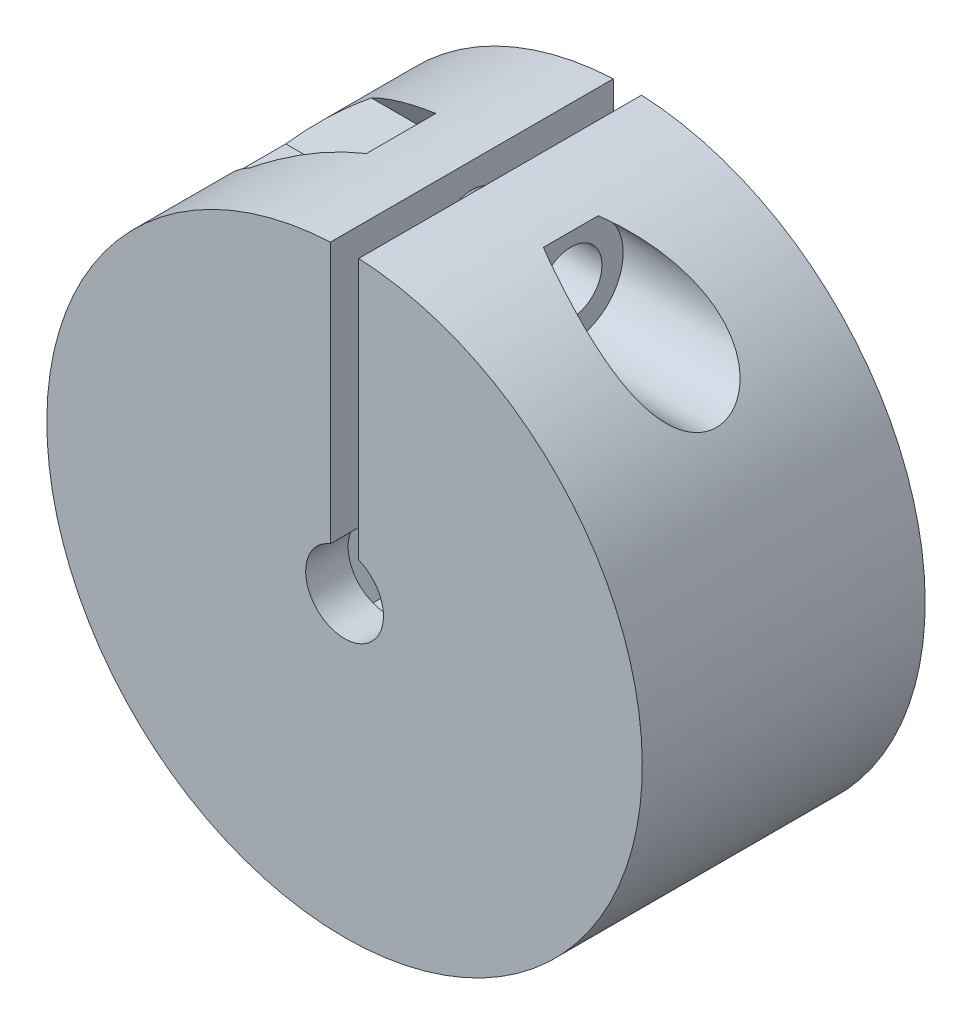
ISO-10303-21;
HEADER;
FILE_DESCRIPTION(('STEP AP214'),'2;1');
FILE_NAME('part.step','',(''),(''),'','','');
FILE_SCHEMA(('AUTOMOTIVE_DESIGN { 1 0 10303 214 1 1 1 1 }'));
ENDSEC;
DATA;
#1=APPLICATION_CONTEXT('core data for automotive mechanical design processes');
#2=APPLICATION_PROTOCOL_DEFINITION('international standard','automotive_design',2000,#1);
#3=PRODUCT_CONTEXT('',#1,'mechanical');
#4=PRODUCT('Part','Part','',(#3));
#5=PRODUCT_RELATED_PRODUCT_CATEGORY('part','',(#4));
#6=PRODUCT_DEFINITION_FORMATION('','',#4);
#7=PRODUCT_DEFINITION_CONTEXT('part definition',#1,'design');
#8=PRODUCT_DEFINITION('design','',#6,#7);
#9=PRODUCT_DEFINITION_SHAPE('','',#8);
#10=(LENGTH_UNIT() NAMED_UNIT(*) SI_UNIT(.MILLI.,.METRE.));
#11=(NAMED_UNIT(*) PLANE_ANGLE_UNIT() SI_UNIT($,.RADIAN.));
#12=(NAMED_UNIT(*) SI_UNIT($,.STERADIAN.) SOLID_ANGLE_UNIT());
#13=UNCERTAINTY_MEASURE_WITH_UNIT(LENGTH_MEASURE(1.E-05),#10,'distance_accuracy_value','');
#14=(GEOMETRIC_REPRESENTATION_CONTEXT(3) GLOBAL_UNCERTAINTY_ASSIGNED_CONTEXT((#13)) GLOBAL_UNIT_ASSIGNED_CONTEXT((#10,
#11,#12)) REPRESENTATION_CONTEXT('',''));
#15=CARTESIAN_POINT('',(0.,0.,0.));
#16=DIRECTION('',(0.,0.,1.));
#17=DIRECTION('',(1.,0.,0.));
#18=AXIS2_PLACEMENT_3D('',#15,#16,#17);
#19=CARTESIAN_POINT('',(2.47027792861067,4.03869536964009,12.));
#20=DIRECTION('',(0.0253419639830613,0.999678840859144,0.));
#21=DIRECTION('',(-0.999678840859144,0.0253419639830613,0.));
#22=AXIS2_PLACEMENT_3D('',#19,#20,#21);
#23=PLANE('',#22);
#24=DIRECTION('',(-0.999678840859144,0.0253419639830613,0.));
#25=VECTOR('',#24,1.);
#26=CARTESIAN_POINT('',(2.47027792861067,4.03869536964009,12.));
#27=LINE('',#26,#25);
#28=CARTESIAN_POINT('',(-1.,4.12666728090159,12.));
#29=VERTEX_POINT('',#28);
#30=CARTESIAN_POINT('',(-2.26247382394956,4.15867112540489,12.));
#31=VERTEX_POINT('',#30);
#32=EDGE_CURVE('E297',#29,#31,#27,.T.);
#33=ORIENTED_EDGE('',*,*,#32,.F.);
#34=DIRECTION('',(0.,0.,1.));
#35=VECTOR('',#34,1.);
#36=CARTESIAN_POINT('',(-1.,4.12666728090159,12.));
#37=LINE('',#36,#35);
#38=CARTESIAN_POINT('',(-1.,4.12666728090159,17.));
#39=VERTEX_POINT('',#38);
#40=EDGE_CURVE('E262',#29,#39,#37,.T.);
#41=ORIENTED_EDGE('',*,*,#40,.T.);
#42=DIRECTION('',(-0.999678840859144,0.0253419639830615,0.));
#43=VECTOR('',#42,1.);
#44=CARTESIAN_POINT('',(2.47027792861067,4.03869536964009,17.));
#45=LINE('',#44,#43);
#46=CARTESIAN_POINT('',(-2.26247382394956,4.15867112540489,17.));
#47=VERTEX_POINT('',#46);
#48=EDGE_CURVE('E277',#39,#47,#45,.T.);
#49=ORIENTED_EDGE('',*,*,#48,.T.);
#50=DIRECTION('',(0.,0.,1.));
#51=VECTOR('',#50,1.);
#52=CARTESIAN_POINT('',(-2.26247382394956,4.15867112540489,12.));
#53=LINE('',#52,#51);
#54=EDGE_CURVE('E327',#31,#47,#53,.T.);
#55=ORIENTED_EDGE('',*,*,#54,.F.);
#56=EDGE_LOOP('',(#33,#41,#49,#55));
#57=FACE_BOUND('',#56,.T.);
#58=ADVANCED_FACE('F35',(#57),#23,.F.);
#59=CARTESIAN_POINT('',(4.73275175256024,-0.119975755764803,12.));
#60=DIRECTION('',(0.87841825380133,0.47789263583845,0.));
#61=DIRECTION('',(-0.47789263583845,0.87841825380133,0.));
#62=AXIS2_PLACEMENT_3D('',#59,#60,#61);
#63=PLANE('',#62);
#64=DIRECTION('',(-0.47789263583845,0.87841825380133,0.));
#65=VECTOR('',#64,1.);
#66=CARTESIAN_POINT('',(4.73275175256024,-0.119975755764803,17.));
#67=LINE('',#66,#65);
#68=CARTESIAN_POINT('',(4.73275175256024,-0.119975755764803,17.));
#69=VERTEX_POINT('',#68);
#70=CARTESIAN_POINT('',(2.47027792861067,4.03869536964009,17.));
#71=VERTEX_POINT('',#70);
#72=EDGE_CURVE('E291',#69,#71,#67,.T.);
#73=ORIENTED_EDGE('',*,*,#72,.T.);
#74=DIRECTION('',(0.,0.,1.));
#75=VECTOR('',#74,1.);
#76=CARTESIAN_POINT('',(2.47027792861067,4.03869536964009,12.));
#77=LINE('',#76,#75);
#78=CARTESIAN_POINT('',(2.47027792861067,4.03869536964009,12.));
#79=VERTEX_POINT('',#78);
#80=EDGE_CURVE('E313',#79,#71,#77,.T.);
#81=ORIENTED_EDGE('',*,*,#80,.F.);
#82=DIRECTION('',(-0.47789263583845,0.87841825380133,0.));
#83=VECTOR('',#82,1.);
#84=CARTESIAN_POINT('',(4.73275175256024,-0.119975755764803,12.));
#85=LINE('',#84,#83);
#86=CARTESIAN_POINT('',(4.73275175256024,-0.119975755764803,12.));
#87=VERTEX_POINT('',#86);
#88=EDGE_CURVE('E294',#87,#79,#85,.T.);
#89=ORIENTED_EDGE('',*,*,#88,.F.);
#90=DIRECTION('',(0.,0.,1.));
#91=VECTOR('',#90,1.);
#92=CARTESIAN_POINT('',(4.73275175256024,-0.119975755764803,12.));
#93=LINE('',#92,#91);
#94=EDGE_CURVE('E314',#87,#69,#93,.T.);
#95=ORIENTED_EDGE('',*,*,#94,.T.);
#96=EDGE_LOOP('',(#73,#81,#89,#95));
#97=FACE_BOUND('',#96,.T.);
#98=ADVANCED_FACE('F420',(#97),#63,.F.);
#99=CARTESIAN_POINT('',(2.26247382394957,-4.15867112540489,12.));
#100=DIRECTION('',(0.853076289818269,-0.521786205020694,0.));
#101=DIRECTION('',(0.521786205020694,0.853076289818269,0.));
#102=AXIS2_PLACEMENT_3D('',#99,#100,#101);
#103=PLANE('',#102);
#104=DIRECTION('',(0.521786205020694,0.853076289818269,0.));
#105=VECTOR('',#104,1.);
#106=CARTESIAN_POINT('',(2.26247382394957,-4.15867112540489,17.));
#107=LINE('',#106,#105);
#108=CARTESIAN_POINT('',(2.26247382394957,-4.15867112540489,17.));
#109=VERTEX_POINT('',#108);
#110=EDGE_CURVE('E289',#109,#69,#107,.T.);
#111=ORIENTED_EDGE('',*,*,#110,.T.);
#112=ORIENTED_EDGE('',*,*,#94,.F.);
#113=DIRECTION('',(0.521786205020694,0.853076289818269,0.));
#114=VECTOR('',#113,1.);
#115=CARTESIAN_POINT('',(2.26247382394957,-4.15867112540489,12.));
#116=LINE('',#115,#114);
#117=CARTESIAN_POINT('',(2.26247382394957,-4.15867112540489,12.));
#118=VERTEX_POINT('',#117);
#119=EDGE_CURVE('E310',#118,#87,#116,.T.);
#120=ORIENTED_EDGE('',*,*,#119,.F.);
#121=DIRECTION('',(0.,0.,1.));
#122=VECTOR('',#121,1.);
#123=CARTESIAN_POINT('',(2.26247382394957,-4.15867112540489,12.));
#124=LINE('',#123,#122);
#125=EDGE_CURVE('E318',#118,#109,#124,.T.);
#126=ORIENTED_EDGE('',*,*,#125,.T.);
#127=EDGE_LOOP('',(#111,#112,#120,#126));
#128=FACE_BOUND('',#127,.T.);
#129=ADVANCED_FACE('F427',(#128),#103,.F.);
#130=CARTESIAN_POINT('',(-2.47027792861067,-4.03869536964009,12.));
#131=DIRECTION('',(-0.0253419639830616,-0.999678840859144,0.));
#132=DIRECTION('',(0.999678840859144,-0.0253419639830616,0.));
#133=AXIS2_PLACEMENT_3D('',#130,#131,#132);
#134=PLANE('',#133);
#135=DIRECTION('',(0.999678840859144,-0.0253419639830616,0.));
#136=VECTOR('',#135,1.);
#137=CARTESIAN_POINT('',(-2.47027792861067,-4.03869536964009,17.));
#138=LINE('',#137,#136);
#139=CARTESIAN_POINT('',(-2.47027792861067,-4.03869536964009,17.));
#140=VERTEX_POINT('',#139);
#141=EDGE_CURVE('E287',#140,#109,#138,.T.);
#142=ORIENTED_EDGE('',*,*,#141,.T.);
#143=ORIENTED_EDGE('',*,*,#125,.F.);
#144=DIRECTION('',(0.999678840859144,-0.0253419639830616,0.));
#145=VECTOR('',#144,1.);
#146=CARTESIAN_POINT('',(-2.47027792861067,-4.03869536964009,12.));
#147=LINE('',#146,#145);
#148=CARTESIAN_POINT('',(-2.47027792861067,-4.03869536964009,12.));
#149=VERTEX_POINT('',#148);
#150=EDGE_CURVE('E307',#149,#118,#147,.T.);
#151=ORIENTED_EDGE('',*,*,#150,.F.);
#152=DIRECTION('',(0.,0.,1.));
#153=VECTOR('',#152,1.);
#154=CARTESIAN_POINT('',(-2.47027792861067,-4.03869536964009,12.));
#155=LINE('',#154,#153);
#156=EDGE_CURVE('E321',#149,#140,#155,.T.);
#157=ORIENTED_EDGE('',*,*,#156,.T.);
#158=EDGE_LOOP('',(#142,#143,#151,#157));
#159=FACE_BOUND('',#158,.T.);
#160=ADVANCED_FACE('F477',(#159),#134,.F.);
#161=CARTESIAN_POINT('',(-4.73275175256023,0.1199757557648,12.));
#162=DIRECTION('',(-0.87841825380133,-0.47789263583845,0.));
#163=DIRECTION('',(0.47789263583845,-0.87841825380133,0.));
#164=AXIS2_PLACEMENT_3D('',#161,#162,#163);
#165=PLANE('',#164);
#166=DIRECTION('',(0.47789263583845,-0.87841825380133,0.));
#167=VECTOR('',#166,1.);
#168=CARTESIAN_POINT('',(-4.73275175256023,0.1199757557648,17.));
#169=LINE('',#168,#167);
#170=CARTESIAN_POINT('',(-4.73275175256023,0.1199757557648,17.));
#171=VERTEX_POINT('',#170);
#172=EDGE_CURVE('E285',#171,#140,#169,.T.);
#173=ORIENTED_EDGE('',*,*,#172,.T.);
#174=ORIENTED_EDGE('',*,*,#156,.F.);
#175=DIRECTION('',(0.47789263583845,-0.87841825380133,0.));
#176=VECTOR('',#175,1.);
#177=CARTESIAN_POINT('',(-4.73275175256023,0.1199757557648,12.));
#178=LINE('',#177,#176);
#179=CARTESIAN_POINT('',(-4.73275175256023,0.1199757557648,12.));
#180=VERTEX_POINT('',#179);
#181=EDGE_CURVE('E304',#180,#149,#178,.T.);
#182=ORIENTED_EDGE('',*,*,#181,.F.);
#183=DIRECTION('',(0.,0.,1.));
#184=VECTOR('',#183,1.);
#185=CARTESIAN_POINT('',(-4.73275175256023,0.1199757557648,12.));
#186=LINE('',#185,#184);
#187=EDGE_CURVE('E324',#180,#171,#186,.T.);
#188=ORIENTED_EDGE('',*,*,#187,.T.);
#189=EDGE_LOOP('',(#173,#174,#182,#188));
#190=FACE_BOUND('',#189,.T.);
#191=ADVANCED_FACE('F442',(#190),#165,.F.);
#192=CARTESIAN_POINT('',(-2.26247382394956,4.15867112540489,12.));
#193=DIRECTION('',(-0.853076289818269,0.521786205020694,0.));
#194=DIRECTION('',(-0.521786205020694,-0.853076289818269,0.));
#195=AXIS2_PLACEMENT_3D('',#192,#193,#194);
#196=PLANE('',#195);
#197=DIRECTION('',(-0.521786205020694,-0.853076289818269,0.));
#198=VECTOR('',#197,1.);
#199=CARTESIAN_POINT('',(-2.26247382394956,4.15867112540489,17.));
#200=LINE('',#199,#198);
#201=EDGE_CURVE('E283',#47,#171,#200,.T.);
#202=ORIENTED_EDGE('',*,*,#201,.T.);
#203=ORIENTED_EDGE('',*,*,#187,.F.);
#204=DIRECTION('',(-0.521786205020694,-0.853076289818269,0.));
#205=VECTOR('',#204,1.);
#206=CARTESIAN_POINT('',(-2.26247382394956,4.15867112540489,12.));
#207=LINE('',#206,#205);
#208=EDGE_CURVE('E301',#31,#180,#207,.T.);
#209=ORIENTED_EDGE('',*,*,#208,.F.);
#210=ORIENTED_EDGE('',*,*,#54,.T.);
#211=EDGE_LOOP('',(#202,#203,#209,#210));
#212=FACE_BOUND('',#211,.T.);
#213=ADVANCED_FACE('F434',(#212),#196,.F.);
#214=CARTESIAN_POINT('',(1.,4.07596707009933,17.));
#215=VERTEX_POINT('',#214);
#216=EDGE_CURVE('E280',#71,#215,#45,.T.);
#217=ORIENTED_EDGE('',*,*,#216,.T.);
#218=DIRECTION('',(0.,0.,-1.));
#219=VECTOR('',#218,1.);
#220=CARTESIAN_POINT('',(1.,4.07596707009933,12.));
#221=LINE('',#220,#219);
#222=CARTESIAN_POINT('',(1.,4.07596707009933,12.));
#223=VERTEX_POINT('',#222);
#224=EDGE_CURVE('E248',#215,#223,#221,.T.);
#225=ORIENTED_EDGE('',*,*,#224,.T.);
#226=EDGE_CURVE('E298',#79,#223,#27,.T.);
#227=ORIENTED_EDGE('',*,*,#226,.F.);
#228=ORIENTED_EDGE('',*,*,#80,.T.);
#229=EDGE_LOOP('',(#217,#225,#227,#228));
#230=FACE_BOUND('',#229,.T.);
#231=ADVANCED_FACE('F423',(#230),#23,.F.);
#232=CARTESIAN_POINT('',(0.,0.,20.));
#233=DIRECTION('',(0.,0.,-1.));
#234=DIRECTION('',(-1.,0.,0.));
#235=AXIS2_PLACEMENT_3D('',#232,#233,#234);
#236=CYLINDRICAL_SURFACE('',#235,6.05);
#237=DIRECTION('',(0.,0.,-1.));
#238=VECTOR('',#237,1.);
#239=CARTESIAN_POINT('',(1.,5.96678305286861,20.));
#240=LINE('',#239,#238);
#241=CARTESIAN_POINT('',(1.,5.96678305286861,1.00000000000001));
#242=VERTEX_POINT('',#241);
#243=CARTESIAN_POINT('',(1.,5.96678305286861,12.));
#244=VERTEX_POINT('',#243);
#245=EDGE_CURVE('E254',#242,#244,#240,.F.);
#246=ORIENTED_EDGE('',*,*,#245,.F.);
#247=CARTESIAN_POINT('',(0.,0.,1.00000000000001));
#248=DIRECTION('',(0.,0.,1.));
#249=DIRECTION('',(1.,0.,0.));
#250=AXIS2_PLACEMENT_3D('',#247,#248,#249);
#251=CIRCLE('',#250,6.05);
#252=CARTESIAN_POINT('',(-1.,5.96678305286861,1.00000000000001));
#253=VERTEX_POINT('',#252);
#254=EDGE_CURVE('E50',#242,#253,#251,.F.);
#255=ORIENTED_EDGE('',*,*,#254,.T.);
#256=DIRECTION('',(0.,0.,-1.));
#257=VECTOR('',#256,1.);
#258=CARTESIAN_POINT('',(-1.,5.96678305286861,20.));
#259=LINE('',#258,#257);
#260=CARTESIAN_POINT('',(-1.,5.96678305286861,12.));
#261=VERTEX_POINT('',#260);
#262=EDGE_CURVE('E268',#261,#253,#259,.T.);
#263=ORIENTED_EDGE('',*,*,#262,.F.);
#264=CARTESIAN_POINT('',(0.,0.,12.));
#265=DIRECTION('',(0.,0.,1.));
#266=DIRECTION('',(1.,0.,0.));
#267=AXIS2_PLACEMENT_3D('',#264,#265,#266);
#268=CIRCLE('',#267,6.05);
#269=EDGE_CURVE('E317',#261,#244,#268,.T.);
#270=ORIENTED_EDGE('',*,*,#269,.T.);
#271=EDGE_LOOP('',(#246,#255,#263,#270));
#272=FACE_BOUND('',#271,.T.);
#273=ADVANCED_FACE('F433',(#272),#236,.F.);
#274=CARTESIAN_POINT('',(0.,0.,20.));
#275=DIRECTION('',(0.,0.,1.));
#276=DIRECTION('',(1.,0.,0.));
#277=AXIS2_PLACEMENT_3D('',#274,#275,#276);
#278=PLANE('',#277);
#279=DIRECTION('',(0.,-1.,0.));
#280=VECTOR('',#279,1.);
#281=CARTESIAN_POINT('',(-1.,0.950298391842352,20.));
#282=LINE('',#281,#280);
#283=CARTESIAN_POINT('',(-1.,21.0262336142258,20.));
#284=VERTEX_POINT('',#283);
#285=CARTESIAN_POINT('',(-1.,2.5617376914899,20.));
#286=VERTEX_POINT('',#285);
#287=EDGE_CURVE('E236',#284,#286,#282,.T.);
#288=ORIENTED_EDGE('',*,*,#287,.F.);
#289=CARTESIAN_POINT('',(0.,0.,20.));
#290=DIRECTION('',(0.,0.,1.));
#291=DIRECTION('',(1.,0.,0.));
#292=AXIS2_PLACEMENT_3D('',#289,#290,#291);
#293=CIRCLE('',#292,21.05);
#294=CARTESIAN_POINT('',(1.,21.0262336142258,20.));
#295=VERTEX_POINT('',#294);
#296=EDGE_CURVE('E334',#284,#295,#293,.T.);
#297=ORIENTED_EDGE('',*,*,#296,.T.);
#298=DIRECTION('',(0.,1.,0.));
#299=VECTOR('',#298,1.);
#300=CARTESIAN_POINT('',(1.,0.950298391842352,20.));
#301=LINE('',#300,#299);
#302=CARTESIAN_POINT('',(1.,2.5617376914899,20.));
#303=VERTEX_POINT('',#302);
#304=EDGE_CURVE('E241',#303,#295,#301,.T.);
#305=ORIENTED_EDGE('',*,*,#304,.F.);
#306=CARTESIAN_POINT('',(0.,0.,20.));
#307=DIRECTION('',(0.,0.,1.));
#308=DIRECTION('',(1.,0.,0.));
#309=AXIS2_PLACEMENT_3D('',#306,#307,#308);
#310=CIRCLE('',#309,2.75);
#311=EDGE_CURVE('E273',#286,#303,#310,.T.);
#312=ORIENTED_EDGE('',*,*,#311,.F.);
#313=EDGE_LOOP('',(#288,#297,#305,#312));
#314=FACE_BOUND('',#313,.T.);
#315=ADVANCED_FACE('F440',(#314),#278,.T.);
#316=CARTESIAN_POINT('',(0.,0.,0.));
#317=DIRECTION('',(0.,0.,1.));
#318=DIRECTION('',(1.,0.,0.));
#319=AXIS2_PLACEMENT_3D('',#316,#317,#318);
#320=PLANE('',#319);
#321=DIRECTION('',(0.,-1.,0.));
#322=VECTOR('',#321,1.);
#323=CARTESIAN_POINT('',(-1.,0.950298391842352,0.));
#324=LINE('',#323,#322);
#325=CARTESIAN_POINT('',(-1.,21.0262336142258,0.));
#326=VERTEX_POINT('',#325);
#327=CARTESIAN_POINT('',(-1.,6.97871764724724,0.));
#328=VERTEX_POINT('',#327);
#329=EDGE_CURVE('E237',#326,#328,#324,.T.);
#330=ORIENTED_EDGE('',*,*,#329,.T.);
#331=CARTESIAN_POINT('',(0.,0.,0.));
#332=DIRECTION('',(0.,0.,1.));
#333=DIRECTION('',(1.,0.,0.));
#334=AXIS2_PLACEMENT_3D('',#331,#332,#333);
#335=CIRCLE('',#334,7.05000000000001);
#336=CARTESIAN_POINT('',(1.,6.97871764724724,0.));
#337=VERTEX_POINT('',#336);
#338=EDGE_CURVE('E388',#328,#337,#335,.T.);
#339=ORIENTED_EDGE('',*,*,#338,.T.);
#340=DIRECTION('',(0.,1.,0.));
#341=VECTOR('',#340,1.);
#342=CARTESIAN_POINT('',(1.,0.950298391842352,0.));
#343=LINE('',#342,#341);
#344=CARTESIAN_POINT('',(1.,21.0262336142258,0.));
#345=VERTEX_POINT('',#344);
#346=EDGE_CURVE('E240',#337,#345,#343,.T.);
#347=ORIENTED_EDGE('',*,*,#346,.T.);
#348=CARTESIAN_POINT('',(0.,0.,0.));
#349=DIRECTION('',(0.,0.,1.));
#350=DIRECTION('',(1.,0.,0.));
#351=AXIS2_PLACEMENT_3D('',#348,#349,#350);
#352=CIRCLE('',#351,21.05);
#353=EDGE_CURVE('E333',#326,#345,#352,.T.);
#354=ORIENTED_EDGE('',*,*,#353,.F.);
#355=EDGE_LOOP('',(#330,#339,#347,#354));
#356=FACE_BOUND('',#355,.T.);
#357=ADVANCED_FACE('F462',(#356),#320,.F.);
#358=CARTESIAN_POINT('',(0.,0.,20.));
#359=DIRECTION('',(0.,0.,-1.));
#360=DIRECTION('',(-1.,0.,0.));
#361=AXIS2_PLACEMENT_3D('',#358,#359,#360);
#362=CYLINDRICAL_SURFACE('',#361,21.05);
#363=CARTESIAN_POINT('',(0.,0.,15.5577085684555));
#364=DIRECTION('',(0.,-0.5,-0.866025403784439));
#365=DIRECTION('',(0.,0.866025403784439,-0.5));
#366=AXIS2_PLACEMENT_3D('',#363,#364,#365);
#367=ELLIPSE('',#366,24.3064463328832,21.05);
#368=CARTESIAN_POINT('',(-16.2946002607943,13.3262336142258,7.86380400399838));
#369=VERTEX_POINT('',#368);
#370=CARTESIAN_POINT('',(-12.3777974177075,17.0262336142258,5.72760800799677));
#371=VERTEX_POINT('',#370);
#372=EDGE_CURVE('E394',#369,#371,#367,.T.);
#373=ORIENTED_EDGE('',*,*,#372,.T.);
#374=CARTESIAN_POINT('',(0.,0.,-4.10249255246198));
#375=DIRECTION('',(0.,0.5,-0.866025403784439));
#376=DIRECTION('',(0.,-0.866025403784439,-0.5));
#377=AXIS2_PLACEMENT_3D('',#374,#375,#376);
#378=ELLIPSE('',#377,24.3064463328832,21.05);
#379=CARTESIAN_POINT('',(-6.,20.1767812100939,7.54657751056595));
#380=VERTEX_POINT('',#379);
#381=EDGE_CURVE('E391',#371,#380,#378,.T.);
#382=ORIENTED_EDGE('',*,*,#381,.T.);
#383=DIRECTION('',(0.,0.,-1.));
#384=VECTOR('',#383,1.);
#385=CARTESIAN_POINT('',(-6.,20.1767812100939,20.));
#386=LINE('',#385,#384);
#387=CARTESIAN_POINT('',(-6.,20.1767812100939,12.453422489434));
#388=VERTEX_POINT('',#387);
#389=EDGE_CURVE('E223',#380,#388,#386,.F.);
#390=ORIENTED_EDGE('',*,*,#389,.T.);
#391=CARTESIAN_POINT('',(0.,0.,24.102492552462));
#392=DIRECTION('',(0.,0.5,0.866025403784439));
#393=DIRECTION('',(0.,0.866025403784439,-0.5));
#394=AXIS2_PLACEMENT_3D('',#391,#392,#393);
#395=ELLIPSE('',#394,24.3064463328832,21.05);
#396=CARTESIAN_POINT('',(-12.3777974177075,17.0262336142258,14.2723919920032));
#397=VERTEX_POINT('',#396);
#398=EDGE_CURVE('E200',#388,#397,#395,.T.);
#399=ORIENTED_EDGE('',*,*,#398,.T.);
#400=CARTESIAN_POINT('',(0.,0.,4.44229143154449));
#401=DIRECTION('',(0.,-0.5,0.866025403784439));
#402=DIRECTION('',(0.,-0.866025403784439,-0.5));
#403=AXIS2_PLACEMENT_3D('',#400,#401,#402);
#404=ELLIPSE('',#403,24.3064463328832,21.05);
#405=CARTESIAN_POINT('',(-16.2946002607943,13.3262336142258,12.1361959960016));
#406=VERTEX_POINT('',#405);
#407=EDGE_CURVE('E191',#397,#406,#404,.T.);
#408=ORIENTED_EDGE('',*,*,#407,.T.);
#409=DIRECTION('',(0.,0.,-1.));
#410=VECTOR('',#409,1.);
#411=CARTESIAN_POINT('',(-16.2946002607943,13.3262336142258,20.));
#412=LINE('',#411,#410);
#413=EDGE_CURVE('E397',#406,#369,#412,.T.);
#414=ORIENTED_EDGE('',*,*,#413,.T.);
#415=EDGE_LOOP('',(#373,#382,#390,#399,#408,#414));
#416=FACE_BOUND('',#415,.T.);
#417=DIRECTION('',(0.,0.,-1.));
#418=VECTOR('',#417,1.);
#419=CARTESIAN_POINT('',(6.,20.1767812100939,20.));
#420=LINE('',#419,#418);
#421=CARTESIAN_POINT('',(6.,20.1767812100939,11.9401159362702));
#422=VERTEX_POINT('',#421);
#423=CARTESIAN_POINT('',(6.,20.1767812100939,8.05988406372979));
#424=VERTEX_POINT('',#423);
#425=EDGE_CURVE('E229',#422,#424,#420,.T.);
#426=ORIENTED_EDGE('',*,*,#425,.T.);
#427=CARTESIAN_POINT('',(6.,20.1767812100939,8.05988406372979));
#428=CARTESIAN_POINT('',(6.09475134567419,20.148605563123,8.01413866028942));
#429=CARTESIAN_POINT('',(6.18971085771348,20.1196401070366,7.96932405989598));
#430=CARTESIAN_POINT('',(6.37993786078398,20.0601300652244,7.88144002976004));
#431=CARTESIAN_POINT('',(6.47520534010495,20.0295855388946,7.83837053448472));
#432=CARTESIAN_POINT('',(6.76130693359646,19.9355844322962,7.71160488935035));
#433=CARTESIAN_POINT('',(6.95245114594906,19.8697570777755,7.63034633602395));
#434=CARTESIAN_POINT('',(7.3353926587368,19.7316004709209,7.47375576499827));
#435=CARTESIAN_POINT('',(7.52719043591848,19.6592562421189,7.39843818509546));
#436=CARTESIAN_POINT('',(7.91056491556636,19.5081499741179,7.25390820316072));
#437=CARTESIAN_POINT('',(8.10214161531466,19.4293878568528,7.18469587541337));
#438=CARTESIAN_POINT('',(8.48710594159245,19.2643696801671,7.05176129216089));
#439=CARTESIAN_POINT('',(8.68048618307354,19.1780320906116,6.98811868942214));
#440=CARTESIAN_POINT('',(9.06629618092993,18.9986848416369,6.8677325182608));
#441=CARTESIAN_POINT('',(9.25872596909865,18.9056754070339,6.81098871754778));
#442=CARTESIAN_POINT('',(9.64210863974482,18.7130493339493,6.70504587795632));
#443=CARTESIAN_POINT('',(9.83306279651451,18.6134393324439,6.65583942025028));
#444=CARTESIAN_POINT('',(10.2132881559255,18.4075521925411,6.56567523991312));
#445=CARTESIAN_POINT('',(10.4025596126438,18.3012760808977,6.52471625102945));
#446=CARTESIAN_POINT('',(10.7939744649844,18.0734024797298,6.44908856140324));
#447=CARTESIAN_POINT('',(10.9959480080094,17.9512583539615,6.41517652335615));
#448=CARTESIAN_POINT('',(11.3968703988491,17.6994314542138,6.35947334027929));
#449=CARTESIAN_POINT('',(11.5958193007153,17.569748815151,6.33768197839962));
#450=CARTESIAN_POINT('',(11.9893697497626,17.3035770649909,6.30798656241061));
#451=CARTESIAN_POINT('',(12.1839821547867,17.1671086029799,6.30004274679215));
#452=CARTESIAN_POINT('',(12.5684743641818,16.8876399102622,6.29995760450506));
#453=CARTESIAN_POINT('',(12.7583553266817,16.744641302722,6.30781237153));
#454=CARTESIAN_POINT('',(13.0865256999192,16.488707253429,6.33757457430906));
#455=CARTESIAN_POINT('',(13.2260930174583,16.3769554556976,6.35558304582341));
#456=CARTESIAN_POINT('',(13.501150305028,16.1509474030824,6.40316682153787));
#457=CARTESIAN_POINT('',(13.6366413326395,16.0366918113313,6.43273909718211));
#458=CARTESIAN_POINT('',(13.9026611708809,15.8066248764245,6.50470797170188));
#459=CARTESIAN_POINT('',(14.0331940999522,15.6908149376337,6.5470936527557));
#460=CARTESIAN_POINT('',(14.2883522050807,15.4588241432693,6.64602830016582));
#461=CARTESIAN_POINT('',(14.4129796877696,15.3426434517544,6.70257168146549));
#462=CARTESIAN_POINT('',(14.7031172456683,15.065696873292,6.85669279497103));
#463=CARTESIAN_POINT('',(14.8653280299254,14.9054493138006,6.96165673074108));
#464=CARTESIAN_POINT('',(15.1716869752382,14.5934952397863,7.20521105209554));
#465=CARTESIAN_POINT('',(15.3158596132359,14.4417773084288,7.34375510390418));
#466=CARTESIAN_POINT('',(15.5546922140777,14.1837443362204,7.62533299295675));
#467=CARTESIAN_POINT('',(15.6534968414161,14.0744003524941,7.76199464752499));
#468=CARTESIAN_POINT('',(15.7881574570766,13.9226864034335,7.98355837642808));
#469=CARTESIAN_POINT('',(15.8308023819074,13.8741467839207,8.06021219639628));
#470=CARTESIAN_POINT('',(15.9111772877102,13.7818964374885,8.2187986968432));
#471=CARTESIAN_POINT('',(15.9489095136484,13.7381835063048,8.300728940379));
#472=CARTESIAN_POINT('',(16.019392575802,13.6559337795078,8.47028099878339));
#473=CARTESIAN_POINT('',(16.0520941457357,13.617448561147,8.55794842108753));
#474=CARTESIAN_POINT('',(16.1116888126376,13.546885883303,8.73767979314388));
#475=CARTESIAN_POINT('',(16.1385850007974,13.5148050143831,8.82974137109104));
#476=CARTESIAN_POINT('',(16.1862299101076,13.45770582487,9.01753534687722));
#477=CARTESIAN_POINT('',(16.2069812389031,13.4326845086841,9.11326616809345));
#478=CARTESIAN_POINT('',(16.2420598537406,13.3902484437647,9.30754601728305));
#479=CARTESIAN_POINT('',(16.2563882823645,13.3728323421394,9.40609454068926));
#480=CARTESIAN_POINT('',(16.2768277931516,13.3479434531705,9.59065652288996));
#481=CARTESIAN_POINT('',(16.2838255397786,13.3393993896301,9.67642966386972));
#482=CARTESIAN_POINT('',(16.2928927520835,13.3283231478429,9.84865365993674));
#483=CARTESIAN_POINT('',(16.2949606739256,13.3257928528832,9.93510471882111));
#484=CARTESIAN_POINT('',(16.2941377172386,13.3267992546046,10.1078860299638));
#485=CARTESIAN_POINT('',(16.2912506187944,13.3303313264291,10.1942163240736));
#486=CARTESIAN_POINT('',(16.2805629907277,13.3433815419319,10.3661265219361));
#487=CARTESIAN_POINT('',(16.2727606519194,13.3529018897536,10.4517061376163));
#488=CARTESIAN_POINT('',(16.2434114497831,13.3886164409179,10.695250488386));
#489=CARTESIAN_POINT('',(16.2158126685684,13.4221107930268,10.8515127933012));
#490=CARTESIAN_POINT('',(16.1446950278144,13.50756691978,11.1549441642479));
#491=CARTESIAN_POINT('',(16.1011755475689,13.5595294144466,11.3021128754824));
#492=CARTESIAN_POINT('',(15.9970835048903,13.6821991993866,11.5916558955347));
#493=CARTESIAN_POINT('',(15.9357616494951,13.7537196225291,11.7334141700313));
#494=CARTESIAN_POINT('',(15.7990674019587,13.9105285165223,12.0016436508793));
#495=CARTESIAN_POINT('',(15.7236875022965,13.9958243406748,12.1281066292034));
#496=CARTESIAN_POINT('',(15.526879628018,14.2143601691446,12.4140902816444));
#497=CARTESIAN_POINT('',(15.3993436390577,14.3527797987527,12.5654646218506));
#498=CARTESIAN_POINT('',(15.1250005084469,14.641606116448,12.8359994405474));
#499=CARTESIAN_POINT('',(14.9781560385023,14.7920357959358,12.9550961165927));
#500=CARTESIAN_POINT('',(14.7168129618212,15.0512732002957,13.1314611468079));
#501=CARTESIAN_POINT('',(14.6061169534099,15.1587749962779,13.1965066792558));
#502=CARTESIAN_POINT('',(14.3786588020973,15.3746947440327,13.3132288515907));
#503=CARTESIAN_POINT('',(14.2618943637945,15.4831130292936,13.3649003878751));
#504=CARTESIAN_POINT('',(14.023234252526,15.6995985141276,13.4559868215308));
#505=CARTESIAN_POINT('',(13.9013344451268,15.8076653523389,13.4953916203889));
#506=CARTESIAN_POINT('',(13.6532637281371,16.022416638241,13.5630079046406));
#507=CARTESIAN_POINT('',(13.5270914702256,16.1291006345599,13.5912158200552));
#508=CARTESIAN_POINT('',(13.2042933811783,16.3955133724995,13.6495622535511));
#509=CARTESIAN_POINT('',(13.0052902615825,16.5538431726006,13.6730135606047));
#510=CARTESIAN_POINT('',(12.6007971953904,16.8637911729914,13.6997055597549));
#511=CARTESIAN_POINT('',(12.3953039147948,17.0154058243828,13.7029356887504));
#512=CARTESIAN_POINT('',(11.9787911769043,17.311165352781,13.691986023631));
#513=CARTESIAN_POINT('',(11.7677599184249,17.4552919290611,13.6777654912004));
#514=CARTESIAN_POINT('',(11.3417601612066,17.735048814974,13.6342276614367));
#515=CARTESIAN_POINT('',(11.1267919872081,17.8706798213297,13.6049116039129));
#516=CARTESIAN_POINT('',(10.5730366423493,18.206283101714,13.5131781179928));
#517=CARTESIAN_POINT('',(10.2319852576933,18.4000070972743,13.4414184680767));
#518=CARTESIAN_POINT('',(9.54466671501228,18.7657572168128,13.2718058909693));
#519=CARTESIAN_POINT('',(9.19839602416849,18.937767830477,13.1739344652452));
#520=CARTESIAN_POINT('',(8.50312657291166,19.2599558984749,12.9560613354998));
#521=CARTESIAN_POINT('',(8.1541308479586,19.4101547693977,12.8360816055799));
#522=CARTESIAN_POINT('',(7.63011025593319,19.6193605908219,12.6409753622751));
#523=CARTESIAN_POINT('',(7.45538790073469,19.6864006307079,12.5734339158343));
#524=CARTESIAN_POINT('',(7.10603154266908,19.8151824236184,12.4332752547042));
#525=CARTESIAN_POINT('',(6.93139753273485,19.8769247037384,12.3606585462807));
#526=CARTESIAN_POINT('',(6.6303182833103,19.9789707440163,12.2307357401805));
#527=CARTESIAN_POINT('',(6.50375553429066,20.0205197118169,12.1746736207098));
#528=CARTESIAN_POINT('',(6.25134434732612,20.1007642529534,12.0596461048202));
#529=CARTESIAN_POINT('',(6.12549503406143,20.1394648238447,12.000686111421));
#530=CARTESIAN_POINT('',(6.,20.1767812100939,11.9401159362702));
#531=B_SPLINE_CURVE_WITH_KNOTS('',3,(#427,#428,#429,#430,#431,#432,#433,#434,#435,#436,#437,
#438,#439,#440,#441,#442,#443,#444,#445,#446,#447,#448,#449,#450,#451,#452,#453,#454,#455,#456,
#457,#458,#459,#460,#461,#462,#463,#464,#465,#466,#467,#468,#469,#470,#471,#472,#473,#474,#475,
#476,#477,#478,#479,#480,#481,#482,#483,#484,#485,#486,#487,#488,#489,#490,#491,#492,#493,#494,
#495,#496,#497,#498,#499,#500,#501,#502,#503,#504,#505,#506,#507,#508,#509,#510,#511,#512,#513,
#514,#515,#516,#517,#518,#519,#520,#521,#522,#523,#524,#525,#526,#527,#528,#529,#530),
.UNSPECIFIED.,.F.,.F.,(4,2,2,2,2,2,2,2,2,2,2,2,2,2,2,2,2,2,2,2,2,2,2,2,2,2,2,2,2,2,2,2,2,2,2,2,
2,2,2,2,2,2,2,2,2,2,2,2,2,2,2,4),(0.,0.326753703419853,0.653495125070508,1.3069403154852,
1.96192749102673,2.61692263490837,3.28012448384214,3.94330399583423,4.6058265025473,
5.26824721299052,5.98321201011123,6.69816401545231,7.41105972237787,8.12377918268699,
8.66249660906868,9.20107303995647,9.7391918573696,10.2770987263793,11.02750601266,
11.7768837245628,12.3772329175159,12.6776719417026,12.9779731881401,13.2810501040607,
13.583965240323,13.8867516460778,14.1894841671857,14.4485876043304,14.707772172284,
14.9667591014558,15.2258414134459,15.7099939923237,16.1941654490549,16.7027530649228,
17.2116130674028,17.932251591186,18.6543043623078,19.1560316552802,19.6579501292481,
20.160280718295,20.6627713404382,21.4277223387914,22.1930728974936,22.9602135599365,
23.7272912264654,24.9216928683713,26.1169429251278,27.3110113332787,27.9077795213282,
28.5044882654906,28.9380084849263,29.3707489990424),.UNSPECIFIED.);
#532=EDGE_CURVE('E345',#424,#422,#531,.T.);
#533=ORIENTED_EDGE('',*,*,#532,.T.);
#534=EDGE_LOOP('',(#426,#533));
#535=FACE_BOUND('',#534,.T.);
#536=ORIENTED_EDGE('',*,*,#296,.F.);
#537=DIRECTION('',(0.,0.,-1.));
#538=VECTOR('',#537,1.);
#539=CARTESIAN_POINT('',(-1.,21.0262336142258,20.));
#540=LINE('',#539,#538);
#541=EDGE_CURVE('E270',#284,#326,#540,.T.);
#542=ORIENTED_EDGE('',*,*,#541,.T.);
#543=ORIENTED_EDGE('',*,*,#353,.T.);
#544=DIRECTION('',(0.,0.,-1.));
#545=VECTOR('',#544,1.);
#546=CARTESIAN_POINT('',(1.,21.0262336142258,20.));
#547=LINE('',#546,#545);
#548=EDGE_CURVE('E256',#345,#295,#547,.F.);
#549=ORIENTED_EDGE('',*,*,#548,.T.);
#550=EDGE_LOOP('',(#536,#542,#543,#549));
#551=FACE_BOUND('',#550,.T.);
#552=ADVANCED_FACE('F358',(#416,#535,#551),#362,.T.);
#553=CARTESIAN_POINT('',(0.,0.,12.));
#554=DIRECTION('',(0.,0.,1.));
#555=DIRECTION('',(1.,0.,0.));
#556=AXIS2_PLACEMENT_3D('',#553,#554,#555);
#557=PLANE('',#556);
#558=ORIENTED_EDGE('',*,*,#269,.F.);
#559=DIRECTION('',(0.,-1.,0.));
#560=VECTOR('',#559,1.);
#561=CARTESIAN_POINT('',(-1.,0.,12.));
#562=LINE('',#561,#560);
#563=EDGE_CURVE('E265',#261,#29,#562,.T.);
#564=ORIENTED_EDGE('',*,*,#563,.T.);
#565=ORIENTED_EDGE('',*,*,#32,.T.);
#566=ORIENTED_EDGE('',*,*,#208,.T.);
#567=ORIENTED_EDGE('',*,*,#181,.T.);
#568=ORIENTED_EDGE('',*,*,#150,.T.);
#569=ORIENTED_EDGE('',*,*,#119,.T.);
#570=ORIENTED_EDGE('',*,*,#88,.T.);
#571=ORIENTED_EDGE('',*,*,#226,.T.);
#572=DIRECTION('',(0.,1.,0.));
#573=VECTOR('',#572,1.);
#574=CARTESIAN_POINT('',(1.,0.,12.));
#575=LINE('',#574,#573);
#576=EDGE_CURVE('E251',#223,#244,#575,.T.);
#577=ORIENTED_EDGE('',*,*,#576,.T.);
#578=EDGE_LOOP('',(#558,#564,#565,#566,#567,#568,#569,#570,#571,#577));
#579=FACE_BOUND('',#578,.T.);
#580=ADVANCED_FACE('F469',(#579),#557,.F.);
#581=CARTESIAN_POINT('',(0.,0.,17.));
#582=DIRECTION('',(0.,0.,1.));
#583=DIRECTION('',(1.,0.,0.));
#584=AXIS2_PLACEMENT_3D('',#581,#582,#583);
#585=PLANE('',#584);
#586=ORIENTED_EDGE('',*,*,#48,.F.);
#587=DIRECTION('',(0.,-1.,0.));
#588=VECTOR('',#587,1.);
#589=CARTESIAN_POINT('',(-1.,0.,17.));
#590=LINE('',#589,#588);
#591=CARTESIAN_POINT('',(-1.,2.5617376914899,17.));
#592=VERTEX_POINT('',#591);
#593=EDGE_CURVE('E259',#39,#592,#590,.T.);
#594=ORIENTED_EDGE('',*,*,#593,.T.);
#595=CARTESIAN_POINT('',(0.,0.,17.));
#596=DIRECTION('',(0.,0.,1.));
#597=DIRECTION('',(1.,0.,0.));
#598=AXIS2_PLACEMENT_3D('',#595,#596,#597);
#599=CIRCLE('',#598,2.75);
#600=CARTESIAN_POINT('',(1.,2.5617376914899,17.));
#601=VERTEX_POINT('',#600);
#602=EDGE_CURVE('E274',#592,#601,#599,.T.);
#603=ORIENTED_EDGE('',*,*,#602,.T.);
#604=DIRECTION('',(0.,1.,0.));
#605=VECTOR('',#604,1.);
#606=CARTESIAN_POINT('',(1.,0.,17.));
#607=LINE('',#606,#605);
#608=EDGE_CURVE('E243',#601,#215,#607,.T.);
#609=ORIENTED_EDGE('',*,*,#608,.T.);
#610=ORIENTED_EDGE('',*,*,#216,.F.);
#611=ORIENTED_EDGE('',*,*,#72,.F.);
#612=ORIENTED_EDGE('',*,*,#110,.F.);
#613=ORIENTED_EDGE('',*,*,#141,.F.);
#614=ORIENTED_EDGE('',*,*,#172,.F.);
#615=ORIENTED_EDGE('',*,*,#201,.F.);
#616=EDGE_LOOP('',(#586,#594,#603,#609,#610,#611,#612,#613,#614,#615));
#617=FACE_BOUND('',#616,.T.);
#618=ADVANCED_FACE('F449',(#617),#585,.F.);
#619=CARTESIAN_POINT('',(0.,0.,17.));
#620=DIRECTION('',(0.,0.,1.));
#621=DIRECTION('',(1.,0.,0.));
#622=AXIS2_PLACEMENT_3D('',#619,#620,#621);
#623=CYLINDRICAL_SURFACE('',#622,2.75);
#624=ORIENTED_EDGE('',*,*,#602,.F.);
#625=DIRECTION('',(0.,0.,1.));
#626=VECTOR('',#625,1.);
#627=CARTESIAN_POINT('',(-1.,2.5617376914899,17.));
#628=LINE('',#627,#626);
#629=EDGE_CURVE('E342',#592,#286,#628,.T.);
#630=ORIENTED_EDGE('',*,*,#629,.T.);
#631=ORIENTED_EDGE('',*,*,#311,.T.);
#632=DIRECTION('',(0.,0.,1.));
#633=VECTOR('',#632,1.);
#634=CARTESIAN_POINT('',(1.,2.5617376914899,17.));
#635=LINE('',#634,#633);
#636=EDGE_CURVE('E337',#303,#601,#635,.F.);
#637=ORIENTED_EDGE('',*,*,#636,.T.);
#638=EDGE_LOOP('',(#624,#630,#631,#637));
#639=FACE_BOUND('',#638,.T.);
#640=ADVANCED_FACE('F378',(#639),#623,.F.);
#641=CARTESIAN_POINT('',(1.,0.950298391842352,0.));
#642=DIRECTION('',(1.,0.,0.));
#643=DIRECTION('',(0.,0.,-1.));
#644=AXIS2_PLACEMENT_3D('',#641,#642,#643);
#645=PLANE('',#644);
#646=CARTESIAN_POINT('',(1.,17.0262336142258,9.99999999999999));
#647=DIRECTION('',(1.,0.,0.));
#648=DIRECTION('',(0.,0.,-1.));
#649=AXIS2_PLACEMENT_3D('',#646,#647,#648);
#650=CIRCLE('',#649,2.2);
#651=CARTESIAN_POINT('',(1.,17.0262336142258,7.79999999999999));
#652=VERTEX_POINT('',#651);
#653=EDGE_CURVE('E233',#652,#652,#650,.T.);
#654=ORIENTED_EDGE('',*,*,#653,.T.);
#655=EDGE_LOOP('',(#654));
#656=FACE_BOUND('',#655,.T.);
#657=ORIENTED_EDGE('',*,*,#346,.F.);
#658=CARTESIAN_POINT('',(1.,6.97871764724724,0.));
#659=CARTESIAN_POINT('',(1.,6.81021461922746,0.166821221832469));
#660=CARTESIAN_POINT('',(1.,6.64163522370551,0.333565164747612));
#661=CARTESIAN_POINT('',(1.,6.30432369225086,0.666898498085902));
#662=CARTESIAN_POINT('',(1.,6.13559155631327,0.833487888504095));
#663=CARTESIAN_POINT('',(1.,5.96678305286861,1.00000000000001));
#664=B_SPLINE_CURVE_WITH_KNOTS('',3,(#658,#659,#660,#661,#662,#663),.UNSPECIFIED.,.F.,.F.,(4,2,
4),(0.,0.711338875530436,1.42267777386352),.UNSPECIFIED.);
#665=EDGE_CURVE('E64',#337,#242,#664,.T.);
#666=ORIENTED_EDGE('',*,*,#665,.T.);
#667=ORIENTED_EDGE('',*,*,#245,.T.);
#668=ORIENTED_EDGE('',*,*,#576,.F.);
#669=ORIENTED_EDGE('',*,*,#224,.F.);
#670=ORIENTED_EDGE('',*,*,#608,.F.);
#671=ORIENTED_EDGE('',*,*,#636,.F.);
#672=ORIENTED_EDGE('',*,*,#304,.T.);
#673=ORIENTED_EDGE('',*,*,#548,.F.);
#674=EDGE_LOOP('',(#657,#666,#667,#668,#669,#670,#671,#672,#673));
#675=FACE_BOUND('',#674,.T.);
#676=ADVANCED_FACE('F374',(#656,#675),#645,.F.);
#677=CARTESIAN_POINT('',(-1.,0.950298391842352,0.));
#678=DIRECTION('',(-1.,0.,0.));
#679=DIRECTION('',(0.,0.,1.));
#680=AXIS2_PLACEMENT_3D('',#677,#678,#679);
#681=PLANE('',#680);
#682=CARTESIAN_POINT('',(-1.,17.0262336142258,9.99999999999999));
#683=DIRECTION('',(-1.,0.,0.));
#684=DIRECTION('',(0.,0.,1.));
#685=AXIS2_PLACEMENT_3D('',#682,#683,#684);
#686=CIRCLE('',#685,2.2);
#687=CARTESIAN_POINT('',(-1.,17.0262336142258,12.2));
#688=VERTEX_POINT('',#687);
#689=EDGE_CURVE('E232',#688,#688,#686,.T.);
#690=ORIENTED_EDGE('',*,*,#689,.T.);
#691=EDGE_LOOP('',(#690));
#692=FACE_BOUND('',#691,.T.);
#693=ORIENTED_EDGE('',*,*,#262,.T.);
#694=CARTESIAN_POINT('',(-1.,5.96678305286861,1.00000000000001));
#695=CARTESIAN_POINT('',(-1.,6.13559155631327,0.833487888504096));
#696=CARTESIAN_POINT('',(-1.,6.30432369225086,0.666898498085902));
#697=CARTESIAN_POINT('',(-1.,6.64163522370551,0.333565164747612));
#698=CARTESIAN_POINT('',(-1.,6.81021461922746,0.166821221832469));
#699=CARTESIAN_POINT('',(-1.,6.97871764724724,0.));
#700=B_SPLINE_CURVE_WITH_KNOTS('',3,(#694,#695,#696,#697,#698,#699),.UNSPECIFIED.,.F.,.F.,(4,2,
4),(0.,0.711338898333082,1.42267777386352),.UNSPECIFIED.);
#701=EDGE_CURVE('E11',#253,#328,#700,.T.);
#702=ORIENTED_EDGE('',*,*,#701,.T.);
#703=ORIENTED_EDGE('',*,*,#329,.F.);
#704=ORIENTED_EDGE('',*,*,#541,.F.);
#705=ORIENTED_EDGE('',*,*,#287,.T.);
#706=ORIENTED_EDGE('',*,*,#629,.F.);
#707=ORIENTED_EDGE('',*,*,#593,.F.);
#708=ORIENTED_EDGE('',*,*,#40,.F.);
#709=ORIENTED_EDGE('',*,*,#563,.F.);
#710=EDGE_LOOP('',(#693,#702,#703,#704,#705,#706,#707,#708,#709));
#711=FACE_BOUND('',#710,.T.);
#712=ADVANCED_FACE('F377',(#692,#711),#681,.F.);
#713=CARTESIAN_POINT('',(21.05,17.0262336142258,9.99999999999999));
#714=DIRECTION('',(-1.,0.,0.));
#715=DIRECTION('',(0.,0.,1.));
#716=AXIS2_PLACEMENT_3D('',#713,#714,#715);
#717=CYLINDRICAL_SURFACE('',#716,2.2);
#718=CARTESIAN_POINT('',(-6.,17.0262336142258,9.99999999999999));
#719=DIRECTION('',(1.,0.,0.));
#720=DIRECTION('',(0.,0.,-1.));
#721=AXIS2_PLACEMENT_3D('',#718,#719,#720);
#722=CIRCLE('',#721,2.2);
#723=CARTESIAN_POINT('',(-6.,17.0262336142258,7.79999999999999));
#724=VERTEX_POINT('',#723);
#725=EDGE_CURVE('E219',#724,#724,#722,.F.);
#726=ORIENTED_EDGE('',*,*,#725,.T.);
#727=EDGE_LOOP('',(#726));
#728=FACE_BOUND('',#727,.T.);
#729=ORIENTED_EDGE('',*,*,#689,.F.);
#730=EDGE_LOOP('',(#729));
#731=FACE_BOUND('',#730,.T.);
#732=ADVANCED_FACE('F372',(#728,#731),#717,.F.);
#733=CARTESIAN_POINT('',(6.,17.0262336142258,9.99999999999999));
#734=DIRECTION('',(-1.,0.,0.));
#735=DIRECTION('',(0.,0.,1.));
#736=AXIS2_PLACEMENT_3D('',#733,#734,#735);
#737=CIRCLE('',#736,2.2);
#738=CARTESIAN_POINT('',(6.,17.0262336142258,12.2));
#739=VERTEX_POINT('',#738);
#740=EDGE_CURVE('E228',#739,#739,#737,.F.);
#741=ORIENTED_EDGE('',*,*,#740,.T.);
#742=EDGE_LOOP('',(#741));
#743=FACE_BOUND('',#742,.T.);
#744=ORIENTED_EDGE('',*,*,#653,.F.);
#745=EDGE_LOOP('',(#744));
#746=FACE_BOUND('',#745,.T.);
#747=ADVANCED_FACE('F367',(#743,#746),#717,.F.);
#748=CARTESIAN_POINT('',(26.,17.0262336142258,9.99999999999999));
#749=DIRECTION('',(-1.,0.,0.));
#750=DIRECTION('',(0.,0.,1.));
#751=AXIS2_PLACEMENT_3D('',#748,#749,#750);
#752=CYLINDRICAL_SURFACE('',#751,3.7);
#753=CARTESIAN_POINT('',(6.,17.0262336142258,9.99999999999999));
#754=DIRECTION('',(-1.,0.,0.));
#755=DIRECTION('',(0.,0.,1.));
#756=AXIS2_PLACEMENT_3D('',#753,#754,#755);
#757=CIRCLE('',#756,3.7);
#758=EDGE_CURVE('E225',#424,#422,#757,.T.);
#759=ORIENTED_EDGE('',*,*,#758,.T.);
#760=ORIENTED_EDGE('',*,*,#532,.F.);
#761=EDGE_LOOP('',(#759,#760));
#762=FACE_BOUND('',#761,.T.);
#763=ADVANCED_FACE('F361',(#762),#752,.F.);
#764=CARTESIAN_POINT('',(6.,17.0262336142258,9.99999999999999));
#765=DIRECTION('',(-1.,0.,0.));
#766=DIRECTION('',(0.,0.,1.));
#767=AXIS2_PLACEMENT_3D('',#764,#765,#766);
#768=PLANE('',#767);
#769=ORIENTED_EDGE('',*,*,#740,.F.);
#770=EDGE_LOOP('',(#769));
#771=FACE_BOUND('',#770,.T.);
#772=ORIENTED_EDGE('',*,*,#758,.F.);
#773=ORIENTED_EDGE('',*,*,#425,.F.);
#774=EDGE_LOOP('',(#772,#773));
#775=FACE_BOUND('',#774,.T.);
#776=ADVANCED_FACE('F366',(#771,#775),#768,.F.);
#777=CARTESIAN_POINT('',(-26.,17.0262336142258,5.72760800799677));
#778=DIRECTION('',(0.,0.5,-0.866025403784439));
#779=DIRECTION('',(0.,0.866025403784439,0.5));
#780=AXIS2_PLACEMENT_3D('',#777,#778,#779);
#781=PLANE('',#780);
#782=DIRECTION('',(1.,0.,0.));
#783=VECTOR('',#782,1.);
#784=CARTESIAN_POINT('',(-26.,17.0262336142258,5.72760800799677));
#785=LINE('',#784,#783);
#786=CARTESIAN_POINT('',(-6.,17.0262336142258,5.72760800799677));
#787=VERTEX_POINT('',#786);
#788=EDGE_CURVE('E217',#371,#787,#785,.T.);
#789=ORIENTED_EDGE('',*,*,#788,.T.);
#790=DIRECTION('',(0.,0.866025403784439,0.5));
#791=VECTOR('',#790,1.);
#792=CARTESIAN_POINT('',(-6.,17.0262336142258,5.72760800799677));
#793=LINE('',#792,#791);
#794=EDGE_CURVE('E203',#787,#380,#793,.T.);
#795=ORIENTED_EDGE('',*,*,#794,.T.);
#796=ORIENTED_EDGE('',*,*,#381,.F.);
#797=EDGE_LOOP('',(#789,#795,#796));
#798=FACE_BOUND('',#797,.T.);
#799=ADVANCED_FACE('F404',(#798),#781,.F.);
#800=CARTESIAN_POINT('',(-26.,13.3262336142258,7.86380400399838));
#801=DIRECTION('',(0.,-0.5,-0.866025403784439));
#802=DIRECTION('',(0.,0.866025403784439,-0.5));
#803=AXIS2_PLACEMENT_3D('',#800,#801,#802);
#804=PLANE('',#803);
#805=DIRECTION('',(1.,0.,0.));
#806=VECTOR('',#805,1.);
#807=CARTESIAN_POINT('',(-26.,13.3262336142258,7.86380400399838));
#808=LINE('',#807,#806);
#809=CARTESIAN_POINT('',(-6.,13.3262336142258,7.86380400399838));
#810=VERTEX_POINT('',#809);
#811=EDGE_CURVE('E220',#369,#810,#808,.T.);
#812=ORIENTED_EDGE('',*,*,#811,.T.);
#813=DIRECTION('',(0.,0.866025403784439,-0.5));
#814=VECTOR('',#813,1.);
#815=CARTESIAN_POINT('',(-6.,13.3262336142258,7.86380400399838));
#816=LINE('',#815,#814);
#817=EDGE_CURVE('E196',#810,#787,#816,.T.);
#818=ORIENTED_EDGE('',*,*,#817,.T.);
#819=ORIENTED_EDGE('',*,*,#788,.F.);
#820=ORIENTED_EDGE('',*,*,#372,.F.);
#821=EDGE_LOOP('',(#812,#818,#819,#820));
#822=FACE_BOUND('',#821,.T.);
#823=ADVANCED_FACE('F407',(#822),#804,.F.);
#824=CARTESIAN_POINT('',(-26.,13.3262336142258,12.1361959960016));
#825=DIRECTION('',(0.,-1.,0.));
#826=DIRECTION('',(0.,0.,-1.));
#827=AXIS2_PLACEMENT_3D('',#824,#825,#826);
#828=PLANE('',#827);
#829=DIRECTION('',(1.,0.,0.));
#830=VECTOR('',#829,1.);
#831=CARTESIAN_POINT('',(-26.,13.3262336142258,12.1361959960016));
#832=LINE('',#831,#830);
#833=CARTESIAN_POINT('',(-6.,13.3262336142258,12.1361959960016));
#834=VERTEX_POINT('',#833);
#835=EDGE_CURVE('E195',#406,#834,#832,.T.);
#836=ORIENTED_EDGE('',*,*,#835,.T.);
#837=DIRECTION('',(0.,0.,-1.));
#838=VECTOR('',#837,1.);
#839=CARTESIAN_POINT('',(-6.,13.3262336142258,12.1361959960016));
#840=LINE('',#839,#838);
#841=EDGE_CURVE('E210',#834,#810,#840,.T.);
#842=ORIENTED_EDGE('',*,*,#841,.T.);
#843=ORIENTED_EDGE('',*,*,#811,.F.);
#844=ORIENTED_EDGE('',*,*,#413,.F.);
#845=EDGE_LOOP('',(#836,#842,#843,#844));
#846=FACE_BOUND('',#845,.T.);
#847=ADVANCED_FACE('F410',(#846),#828,.F.);
#848=CARTESIAN_POINT('',(-26.,17.0262336142258,14.2723919920032));
#849=DIRECTION('',(0.,-0.5,0.866025403784439));
#850=DIRECTION('',(0.,-0.866025403784439,-0.5));
#851=AXIS2_PLACEMENT_3D('',#848,#849,#850);
#852=PLANE('',#851);
#853=DIRECTION('',(1.,0.,0.));
#854=VECTOR('',#853,1.);
#855=CARTESIAN_POINT('',(-26.,17.0262336142258,14.2723919920032));
#856=LINE('',#855,#854);
#857=CARTESIAN_POINT('',(-6.,17.0262336142258,14.2723919920032));
#858=VERTEX_POINT('',#857);
#859=EDGE_CURVE('E184',#397,#858,#856,.T.);
#860=ORIENTED_EDGE('',*,*,#859,.T.);
#861=DIRECTION('',(0.,-0.866025403784439,-0.5));
#862=VECTOR('',#861,1.);
#863=CARTESIAN_POINT('',(-6.,17.0262336142258,14.2723919920032));
#864=LINE('',#863,#862);
#865=EDGE_CURVE('E189',#858,#834,#864,.T.);
#866=ORIENTED_EDGE('',*,*,#865,.T.);
#867=ORIENTED_EDGE('',*,*,#835,.F.);
#868=ORIENTED_EDGE('',*,*,#407,.F.);
#869=EDGE_LOOP('',(#860,#866,#867,#868));
#870=FACE_BOUND('',#869,.T.);
#871=ADVANCED_FACE('F186',(#870),#852,.F.);
#872=CARTESIAN_POINT('',(-26.,20.7262336142258,12.1361959960016));
#873=DIRECTION('',(0.,0.5,0.866025403784439));
#874=DIRECTION('',(0.,-0.866025403784439,0.5));
#875=AXIS2_PLACEMENT_3D('',#872,#873,#874);
#876=PLANE('',#875);
#877=DIRECTION('',(0.,-0.866025403784438,0.5));
#878=VECTOR('',#877,1.);
#879=CARTESIAN_POINT('',(-6.,20.7262336142258,12.1361959960016));
#880=LINE('',#879,#878);
#881=EDGE_CURVE('E198',#388,#858,#880,.T.);
#882=ORIENTED_EDGE('',*,*,#881,.T.);
#883=ORIENTED_EDGE('',*,*,#859,.F.);
#884=ORIENTED_EDGE('',*,*,#398,.F.);
#885=EDGE_LOOP('',(#882,#883,#884));
#886=FACE_BOUND('',#885,.T.);
#887=ADVANCED_FACE('F199',(#886),#876,.F.);
#888=CARTESIAN_POINT('',(-6.,0.,0.));
#889=DIRECTION('',(1.,0.,0.));
#890=DIRECTION('',(0.,0.,-1.));
#891=AXIS2_PLACEMENT_3D('',#888,#889,#890);
#892=PLANE('',#891);
#893=ORIENTED_EDGE('',*,*,#725,.F.);
#894=EDGE_LOOP('',(#893));
#895=FACE_BOUND('',#894,.T.);
#896=ORIENTED_EDGE('',*,*,#794,.F.);
#897=ORIENTED_EDGE('',*,*,#817,.F.);
#898=ORIENTED_EDGE('',*,*,#841,.F.);
#899=ORIENTED_EDGE('',*,*,#865,.F.);
#900=ORIENTED_EDGE('',*,*,#881,.F.);
#901=ORIENTED_EDGE('',*,*,#389,.F.);
#902=EDGE_LOOP('',(#896,#897,#898,#899,#900,#901));
#903=FACE_BOUND('',#902,.T.);
#904=ADVANCED_FACE('F207',(#895,#903),#892,.F.);
#905=CARTESIAN_POINT('',(0.,0.,0.));
#906=DIRECTION('',(0.,0.,-1.));
#907=DIRECTION('',(-1.,0.,0.));
#908=AXIS2_PLACEMENT_3D('',#905,#906,#907);
#909=CONICAL_SURFACE('',#908,7.05000000000001,0.785398163397448);
#910=ORIENTED_EDGE('',*,*,#701,.F.);
#911=ORIENTED_EDGE('',*,*,#254,.F.);
#912=ORIENTED_EDGE('',*,*,#665,.F.);
#913=ORIENTED_EDGE('',*,*,#338,.F.);
#914=EDGE_LOOP('',(#910,#911,#912,#913));
#915=FACE_BOUND('',#914,.T.);
#916=ADVANCED_FACE('F38',(#915),#909,.F.);
#917=CLOSED_SHELL('',(#58,#98,#129,#160,#191,#213,#231,#273,#315,#357,#552,#580,#618,#640,#676,
#712,#732,#747,#763,#776,#799,#823,#847,#871,#887,#904,#916));
#918=MANIFOLD_SOLID_BREP('B2',#917);
#919=ADVANCED_BREP_SHAPE_REPRESENTATION('',(#18,#918),#14);
#920=SHAPE_DEFINITION_REPRESENTATION(#9,#919);
ENDSEC;
END-ISO-10303-21;
